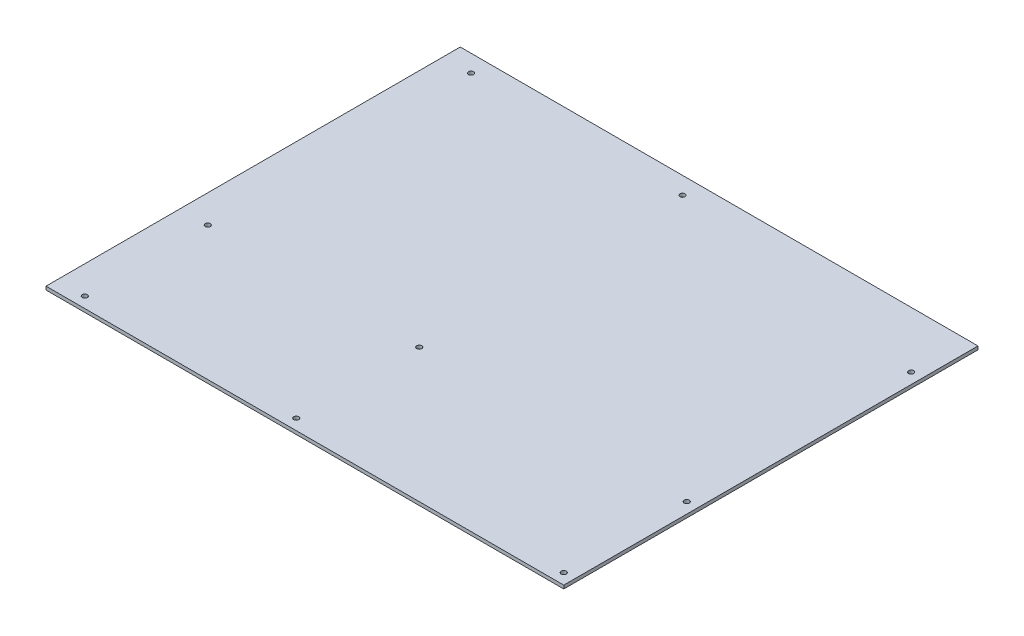
ISO-10303-21;
HEADER;
FILE_DESCRIPTION(('STEP AP214'),'2;1');
FILE_NAME('part.step','',(''),(''),'','','');
FILE_SCHEMA(('AUTOMOTIVE_DESIGN { 1 0 10303 214 1 1 1 1 }'));
ENDSEC;
DATA;
#1=APPLICATION_CONTEXT('core data for automotive mechanical design processes');
#2=APPLICATION_PROTOCOL_DEFINITION('international standard','automotive_design',2000,#1);
#3=PRODUCT_CONTEXT('',#1,'mechanical');
#4=PRODUCT('Part','Part','',(#3));
#5=PRODUCT_RELATED_PRODUCT_CATEGORY('part','',(#4));
#6=PRODUCT_DEFINITION_FORMATION('','',#4);
#7=PRODUCT_DEFINITION_CONTEXT('part definition',#1,'design');
#8=PRODUCT_DEFINITION('design','',#6,#7);
#9=PRODUCT_DEFINITION_SHAPE('','',#8);
#10=(LENGTH_UNIT() NAMED_UNIT(*) SI_UNIT(.MILLI.,.METRE.));
#11=(NAMED_UNIT(*) PLANE_ANGLE_UNIT() SI_UNIT($,.RADIAN.));
#12=(NAMED_UNIT(*) SI_UNIT($,.STERADIAN.) SOLID_ANGLE_UNIT());
#13=UNCERTAINTY_MEASURE_WITH_UNIT(LENGTH_MEASURE(1.E-05),#10,'distance_accuracy_value','');
#14=(GEOMETRIC_REPRESENTATION_CONTEXT(3) GLOBAL_UNCERTAINTY_ASSIGNED_CONTEXT((#13)) GLOBAL_UNIT_ASSIGNED_CONTEXT((#10,
#11,#12)) REPRESENTATION_CONTEXT('',''));
#15=CARTESIAN_POINT('',(0.,0.,0.));
#16=DIRECTION('',(0.,0.,1.));
#17=DIRECTION('',(1.,0.,0.));
#18=AXIS2_PLACEMENT_3D('',#15,#16,#17);
#19=CARTESIAN_POINT('',(0.,2.,0.));
#20=DIRECTION('',(1.,0.,0.));
#21=DIRECTION('',(0.,0.,-1.));
#22=AXIS2_PLACEMENT_3D('',#19,#20,#21);
#23=PLANE('',#22);
#24=DIRECTION('',(0.,0.,1.));
#25=VECTOR('',#24,1.);
#26=CARTESIAN_POINT('',(0.,0.,0.));
#27=LINE('',#26,#25);
#28=CARTESIAN_POINT('',(0.,0.,-243.84));
#29=VERTEX_POINT('',#28);
#30=CARTESIAN_POINT('',(0.,0.,0.));
#31=VERTEX_POINT('',#30);
#32=EDGE_CURVE('E100',#29,#31,#27,.T.);
#33=ORIENTED_EDGE('',*,*,#32,.T.);
#34=DIRECTION('',(0.,-1.,0.));
#35=VECTOR('',#34,1.);
#36=CARTESIAN_POINT('',(0.,2.,0.));
#37=LINE('',#36,#35);
#38=CARTESIAN_POINT('',(0.,2.,0.));
#39=VERTEX_POINT('',#38);
#40=EDGE_CURVE('E11',#39,#31,#37,.T.);
#41=ORIENTED_EDGE('',*,*,#40,.F.);
#42=DIRECTION('',(0.,0.,1.));
#43=VECTOR('',#42,1.);
#44=CARTESIAN_POINT('',(0.,2.,0.));
#45=LINE('',#44,#43);
#46=CARTESIAN_POINT('',(0.,2.,-243.84));
#47=VERTEX_POINT('',#46);
#48=EDGE_CURVE('E88',#47,#39,#45,.T.);
#49=ORIENTED_EDGE('',*,*,#48,.F.);
#50=DIRECTION('',(0.,-1.,0.));
#51=VECTOR('',#50,1.);
#52=CARTESIAN_POINT('',(0.,2.,-243.84));
#53=LINE('',#52,#51);
#54=EDGE_CURVE('E96',#47,#29,#53,.T.);
#55=ORIENTED_EDGE('',*,*,#54,.T.);
#56=EDGE_LOOP('',(#33,#41,#49,#55));
#57=FACE_BOUND('',#56,.T.);
#58=ADVANCED_FACE('F37',(#57),#23,.F.);
#59=CARTESIAN_POINT('',(0.,2.,0.));
#60=DIRECTION('',(0.,0.,-1.));
#61=DIRECTION('',(-1.,0.,0.));
#62=AXIS2_PLACEMENT_3D('',#59,#60,#61);
#63=PLANE('',#62);
#64=DIRECTION('',(1.,0.,0.));
#65=VECTOR('',#64,1.);
#66=CARTESIAN_POINT('',(0.,0.,0.));
#67=LINE('',#66,#65);
#68=CARTESIAN_POINT('',(304.8,0.,0.));
#69=VERTEX_POINT('',#68);
#70=EDGE_CURVE('E92',#31,#69,#67,.T.);
#71=ORIENTED_EDGE('',*,*,#70,.T.);
#72=DIRECTION('',(0.,-1.,0.));
#73=VECTOR('',#72,1.);
#74=CARTESIAN_POINT('',(304.8,2.,0.));
#75=LINE('',#74,#73);
#76=CARTESIAN_POINT('',(304.8,2.,0.));
#77=VERTEX_POINT('',#76);
#78=EDGE_CURVE('E45',#77,#69,#75,.T.);
#79=ORIENTED_EDGE('',*,*,#78,.F.);
#80=DIRECTION('',(1.,0.,0.));
#81=VECTOR('',#80,1.);
#82=CARTESIAN_POINT('',(0.,2.,0.));
#83=LINE('',#82,#81);
#84=EDGE_CURVE('E83',#39,#77,#83,.T.);
#85=ORIENTED_EDGE('',*,*,#84,.F.);
#86=ORIENTED_EDGE('',*,*,#40,.T.);
#87=EDGE_LOOP('',(#71,#79,#85,#86));
#88=FACE_BOUND('',#87,.T.);
#89=ADVANCED_FACE('F91',(#88),#63,.F.);
#90=CARTESIAN_POINT('',(304.8,2.,0.));
#91=DIRECTION('',(-1.,0.,0.));
#92=DIRECTION('',(0.,0.,1.));
#93=AXIS2_PLACEMENT_3D('',#90,#91,#92);
#94=PLANE('',#93);
#95=DIRECTION('',(0.,0.,-1.));
#96=VECTOR('',#95,1.);
#97=CARTESIAN_POINT('',(304.8,0.,0.));
#98=LINE('',#97,#96);
#99=CARTESIAN_POINT('',(304.8,0.,-243.84));
#100=VERTEX_POINT('',#99);
#101=EDGE_CURVE('E70',#69,#100,#98,.T.);
#102=ORIENTED_EDGE('',*,*,#101,.T.);
#103=DIRECTION('',(0.,-1.,0.));
#104=VECTOR('',#103,1.);
#105=CARTESIAN_POINT('',(304.8,2.,-243.84));
#106=LINE('',#105,#104);
#107=CARTESIAN_POINT('',(304.8,2.,-243.84));
#108=VERTEX_POINT('',#107);
#109=EDGE_CURVE('E93',#108,#100,#106,.T.);
#110=ORIENTED_EDGE('',*,*,#109,.F.);
#111=DIRECTION('',(0.,0.,-1.));
#112=VECTOR('',#111,1.);
#113=CARTESIAN_POINT('',(304.8,2.,0.));
#114=LINE('',#113,#112);
#115=EDGE_CURVE('E86',#77,#108,#114,.T.);
#116=ORIENTED_EDGE('',*,*,#115,.F.);
#117=ORIENTED_EDGE('',*,*,#78,.T.);
#118=EDGE_LOOP('',(#102,#110,#116,#117));
#119=FACE_BOUND('',#118,.T.);
#120=ADVANCED_FACE('F94',(#119),#94,.F.);
#121=CARTESIAN_POINT('',(0.,2.,-243.84));
#122=DIRECTION('',(0.,0.,1.));
#123=DIRECTION('',(1.,0.,0.));
#124=AXIS2_PLACEMENT_3D('',#121,#122,#123);
#125=PLANE('',#124);
#126=DIRECTION('',(-1.,0.,0.));
#127=VECTOR('',#126,1.);
#128=CARTESIAN_POINT('',(0.,0.,-243.84));
#129=LINE('',#128,#127);
#130=EDGE_CURVE('E76',#100,#29,#129,.T.);
#131=ORIENTED_EDGE('',*,*,#130,.T.);
#132=ORIENTED_EDGE('',*,*,#54,.F.);
#133=DIRECTION('',(-1.,0.,0.));
#134=VECTOR('',#133,1.);
#135=CARTESIAN_POINT('',(0.,2.,-243.84));
#136=LINE('',#135,#134);
#137=EDGE_CURVE('E53',#108,#47,#136,.T.);
#138=ORIENTED_EDGE('',*,*,#137,.F.);
#139=ORIENTED_EDGE('',*,*,#109,.T.);
#140=EDGE_LOOP('',(#131,#132,#138,#139));
#141=FACE_BOUND('',#140,.T.);
#142=ADVANCED_FACE('F108',(#141),#125,.F.);
#143=CARTESIAN_POINT('',(0.,2.,0.));
#144=DIRECTION('',(0.,-1.,0.));
#145=DIRECTION('',(0.,0.,-1.));
#146=AXIS2_PLACEMENT_3D('',#143,#144,#145);
#147=PLANE('',#146);
#148=CARTESIAN_POINT('',(298.45,2.,-210.82));
#149=DIRECTION('',(0.,1.,0.));
#150=DIRECTION('',(0.,0.,1.));
#151=AXIS2_PLACEMENT_3D('',#148,#149,#150);
#152=CIRCLE('',#151,1.50000000000002);
#153=CARTESIAN_POINT('',(298.45,2.,-209.32));
#154=VERTEX_POINT('',#153);
#155=EDGE_CURVE('E144',#154,#154,#152,.T.);
#156=ORIENTED_EDGE('',*,*,#155,.F.);
#157=EDGE_LOOP('',(#156));
#158=FACE_BOUND('',#157,.T.);
#159=CARTESIAN_POINT('',(140.97,2.,-233.68));
#160=DIRECTION('',(0.,1.,0.));
#161=DIRECTION('',(0.,0.,1.));
#162=AXIS2_PLACEMENT_3D('',#159,#160,#161);
#163=CIRCLE('',#162,1.5);
#164=CARTESIAN_POINT('',(140.97,2.,-232.18));
#165=VERTEX_POINT('',#164);
#166=EDGE_CURVE('E150',#165,#165,#163,.T.);
#167=ORIENTED_EDGE('',*,*,#166,.F.);
#168=EDGE_LOOP('',(#167));
#169=FACE_BOUND('',#168,.T.);
#170=CARTESIAN_POINT('',(16.51,2.,-233.68));
#171=DIRECTION('',(0.,1.,0.));
#172=DIRECTION('',(0.,0.,1.));
#173=AXIS2_PLACEMENT_3D('',#170,#171,#172);
#174=CIRCLE('',#173,1.5);
#175=CARTESIAN_POINT('',(16.51,2.,-232.18));
#176=VERTEX_POINT('',#175);
#177=EDGE_CURVE('E156',#176,#176,#174,.T.);
#178=ORIENTED_EDGE('',*,*,#177,.F.);
#179=EDGE_LOOP('',(#178));
#180=FACE_BOUND('',#179,.T.);
#181=CARTESIAN_POINT('',(16.51,2.,-78.74));
#182=DIRECTION('',(0.,1.,0.));
#183=DIRECTION('',(0.,0.,1.));
#184=AXIS2_PLACEMENT_3D('',#181,#182,#183);
#185=CIRCLE('',#184,1.5);
#186=CARTESIAN_POINT('',(16.51,2.,-77.24));
#187=VERTEX_POINT('',#186);
#188=EDGE_CURVE('E162',#187,#187,#185,.T.);
#189=ORIENTED_EDGE('',*,*,#188,.F.);
#190=EDGE_LOOP('',(#189));
#191=FACE_BOUND('',#190,.T.);
#192=CARTESIAN_POINT('',(140.97,2.,-78.74));
#193=DIRECTION('',(0.,1.,0.));
#194=DIRECTION('',(0.,0.,1.));
#195=AXIS2_PLACEMENT_3D('',#192,#193,#194);
#196=CIRCLE('',#195,1.5);
#197=CARTESIAN_POINT('',(140.97,2.,-77.24));
#198=VERTEX_POINT('',#197);
#199=EDGE_CURVE('E120',#198,#198,#196,.T.);
#200=ORIENTED_EDGE('',*,*,#199,.F.);
#201=EDGE_LOOP('',(#200));
#202=FACE_BOUND('',#201,.T.);
#203=CARTESIAN_POINT('',(298.45,2.,-78.74));
#204=DIRECTION('',(0.,1.,0.));
#205=DIRECTION('',(0.,0.,1.));
#206=AXIS2_PLACEMENT_3D('',#203,#204,#205);
#207=CIRCLE('',#206,1.50000000000002);
#208=CARTESIAN_POINT('',(298.45,2.,-77.2399999999999));
#209=VERTEX_POINT('',#208);
#210=EDGE_CURVE('E127',#209,#209,#207,.T.);
#211=ORIENTED_EDGE('',*,*,#210,.F.);
#212=EDGE_LOOP('',(#211));
#213=FACE_BOUND('',#212,.T.);
#214=CARTESIAN_POINT('',(298.45,2.,-6.34999999999997));
#215=DIRECTION('',(0.,1.,0.));
#216=DIRECTION('',(0.,0.,1.));
#217=AXIS2_PLACEMENT_3D('',#214,#215,#216);
#218=CIRCLE('',#217,1.50000000000002);
#219=CARTESIAN_POINT('',(298.45,2.,-4.84999999999994));
#220=VERTEX_POINT('',#219);
#221=EDGE_CURVE('E133',#220,#220,#218,.T.);
#222=ORIENTED_EDGE('',*,*,#221,.F.);
#223=EDGE_LOOP('',(#222));
#224=FACE_BOUND('',#223,.T.);
#225=CARTESIAN_POINT('',(140.97,2.,-6.34999999999997));
#226=DIRECTION('',(0.,1.,0.));
#227=DIRECTION('',(0.,0.,1.));
#228=AXIS2_PLACEMENT_3D('',#225,#226,#227);
#229=CIRCLE('',#228,1.5);
#230=CARTESIAN_POINT('',(140.97,2.,-4.84999999999997));
#231=VERTEX_POINT('',#230);
#232=EDGE_CURVE('E139',#231,#231,#229,.T.);
#233=ORIENTED_EDGE('',*,*,#232,.F.);
#234=EDGE_LOOP('',(#233));
#235=FACE_BOUND('',#234,.T.);
#236=CARTESIAN_POINT('',(16.51,2.,-6.34999999999997));
#237=DIRECTION('',(0.,1.,0.));
#238=DIRECTION('',(0.,0.,1.));
#239=AXIS2_PLACEMENT_3D('',#236,#237,#238);
#240=CIRCLE('',#239,1.5);
#241=CARTESIAN_POINT('',(16.51,2.,-4.84999999999997));
#242=VERTEX_POINT('',#241);
#243=EDGE_CURVE('E114',#242,#242,#240,.T.);
#244=ORIENTED_EDGE('',*,*,#243,.F.);
#245=EDGE_LOOP('',(#244));
#246=FACE_BOUND('',#245,.T.);
#247=ORIENTED_EDGE('',*,*,#48,.T.);
#248=ORIENTED_EDGE('',*,*,#84,.T.);
#249=ORIENTED_EDGE('',*,*,#115,.T.);
#250=ORIENTED_EDGE('',*,*,#137,.T.);
#251=EDGE_LOOP('',(#247,#248,#249,#250));
#252=FACE_BOUND('',#251,.T.);
#253=ADVANCED_FACE('F84',(#158,#169,#180,#191,#202,#213,#224,#235,#246,#252),#147,.F.);
#254=CARTESIAN_POINT('',(0.,0.,0.));
#255=DIRECTION('',(0.,-1.,0.));
#256=DIRECTION('',(0.,0.,-1.));
#257=AXIS2_PLACEMENT_3D('',#254,#255,#256);
#258=PLANE('',#257);
#259=CARTESIAN_POINT('',(298.45,0.,-210.82));
#260=DIRECTION('',(0.,1.,0.));
#261=DIRECTION('',(0.,0.,1.));
#262=AXIS2_PLACEMENT_3D('',#259,#260,#261);
#263=CIRCLE('',#262,1.50000000000002);
#264=CARTESIAN_POINT('',(298.45,0.,-209.32));
#265=VERTEX_POINT('',#264);
#266=EDGE_CURVE('E147',#265,#265,#263,.T.);
#267=ORIENTED_EDGE('',*,*,#266,.T.);
#268=EDGE_LOOP('',(#267));
#269=FACE_BOUND('',#268,.T.);
#270=CARTESIAN_POINT('',(140.97,0.,-233.68));
#271=DIRECTION('',(0.,1.,0.));
#272=DIRECTION('',(0.,0.,1.));
#273=AXIS2_PLACEMENT_3D('',#270,#271,#272);
#274=CIRCLE('',#273,1.5);
#275=CARTESIAN_POINT('',(140.97,0.,-232.18));
#276=VERTEX_POINT('',#275);
#277=EDGE_CURVE('E153',#276,#276,#274,.T.);
#278=ORIENTED_EDGE('',*,*,#277,.T.);
#279=EDGE_LOOP('',(#278));
#280=FACE_BOUND('',#279,.T.);
#281=CARTESIAN_POINT('',(16.51,0.,-233.68));
#282=DIRECTION('',(0.,1.,0.));
#283=DIRECTION('',(0.,0.,1.));
#284=AXIS2_PLACEMENT_3D('',#281,#282,#283);
#285=CIRCLE('',#284,1.5);
#286=CARTESIAN_POINT('',(16.51,0.,-232.18));
#287=VERTEX_POINT('',#286);
#288=EDGE_CURVE('E159',#287,#287,#285,.T.);
#289=ORIENTED_EDGE('',*,*,#288,.T.);
#290=EDGE_LOOP('',(#289));
#291=FACE_BOUND('',#290,.T.);
#292=CARTESIAN_POINT('',(16.51,0.,-78.74));
#293=DIRECTION('',(0.,1.,0.));
#294=DIRECTION('',(0.,0.,1.));
#295=AXIS2_PLACEMENT_3D('',#292,#293,#294);
#296=CIRCLE('',#295,1.5);
#297=CARTESIAN_POINT('',(16.51,0.,-77.24));
#298=VERTEX_POINT('',#297);
#299=EDGE_CURVE('E124',#298,#298,#296,.T.);
#300=ORIENTED_EDGE('',*,*,#299,.T.);
#301=EDGE_LOOP('',(#300));
#302=FACE_BOUND('',#301,.T.);
#303=CARTESIAN_POINT('',(140.97,0.,-78.74));
#304=DIRECTION('',(0.,1.,0.));
#305=DIRECTION('',(0.,0.,1.));
#306=AXIS2_PLACEMENT_3D('',#303,#304,#305);
#307=CIRCLE('',#306,1.5);
#308=CARTESIAN_POINT('',(140.97,0.,-77.24));
#309=VERTEX_POINT('',#308);
#310=EDGE_CURVE('E123',#309,#309,#307,.T.);
#311=ORIENTED_EDGE('',*,*,#310,.T.);
#312=EDGE_LOOP('',(#311));
#313=FACE_BOUND('',#312,.T.);
#314=CARTESIAN_POINT('',(298.45,0.,-78.74));
#315=DIRECTION('',(0.,1.,0.));
#316=DIRECTION('',(0.,0.,1.));
#317=AXIS2_PLACEMENT_3D('',#314,#315,#316);
#318=CIRCLE('',#317,1.50000000000002);
#319=CARTESIAN_POINT('',(298.45,0.,-77.2399999999999));
#320=VERTEX_POINT('',#319);
#321=EDGE_CURVE('E130',#320,#320,#318,.T.);
#322=ORIENTED_EDGE('',*,*,#321,.T.);
#323=EDGE_LOOP('',(#322));
#324=FACE_BOUND('',#323,.T.);
#325=CARTESIAN_POINT('',(298.45,0.,-6.34999999999997));
#326=DIRECTION('',(0.,1.,0.));
#327=DIRECTION('',(0.,0.,1.));
#328=AXIS2_PLACEMENT_3D('',#325,#326,#327);
#329=CIRCLE('',#328,1.50000000000002);
#330=CARTESIAN_POINT('',(298.45,0.,-4.84999999999994));
#331=VERTEX_POINT('',#330);
#332=EDGE_CURVE('E136',#331,#331,#329,.T.);
#333=ORIENTED_EDGE('',*,*,#332,.T.);
#334=EDGE_LOOP('',(#333));
#335=FACE_BOUND('',#334,.T.);
#336=CARTESIAN_POINT('',(140.97,0.,-6.34999999999997));
#337=DIRECTION('',(0.,1.,0.));
#338=DIRECTION('',(0.,0.,1.));
#339=AXIS2_PLACEMENT_3D('',#336,#337,#338);
#340=CIRCLE('',#339,1.5);
#341=CARTESIAN_POINT('',(140.97,0.,-4.84999999999997));
#342=VERTEX_POINT('',#341);
#343=EDGE_CURVE('E117',#342,#342,#340,.T.);
#344=ORIENTED_EDGE('',*,*,#343,.T.);
#345=EDGE_LOOP('',(#344));
#346=FACE_BOUND('',#345,.T.);
#347=CARTESIAN_POINT('',(16.51,0.,-6.34999999999997));
#348=DIRECTION('',(0.,1.,0.));
#349=DIRECTION('',(0.,0.,1.));
#350=AXIS2_PLACEMENT_3D('',#347,#348,#349);
#351=CIRCLE('',#350,1.5);
#352=CARTESIAN_POINT('',(16.51,0.,-4.84999999999997));
#353=VERTEX_POINT('',#352);
#354=EDGE_CURVE('E103',#353,#353,#351,.T.);
#355=ORIENTED_EDGE('',*,*,#354,.T.);
#356=EDGE_LOOP('',(#355));
#357=FACE_BOUND('',#356,.T.);
#358=ORIENTED_EDGE('',*,*,#32,.F.);
#359=ORIENTED_EDGE('',*,*,#130,.F.);
#360=ORIENTED_EDGE('',*,*,#101,.F.);
#361=ORIENTED_EDGE('',*,*,#70,.F.);
#362=EDGE_LOOP('',(#358,#359,#360,#361));
#363=FACE_BOUND('',#362,.T.);
#364=ADVANCED_FACE('F111',(#269,#280,#291,#302,#313,#324,#335,#346,#357,#363),#258,.T.);
#365=CARTESIAN_POINT('',(16.51,0.,-6.34999999999997));
#366=DIRECTION('',(0.,1.,0.));
#367=DIRECTION('',(0.,0.,1.));
#368=AXIS2_PLACEMENT_3D('',#365,#366,#367);
#369=CYLINDRICAL_SURFACE('',#368,1.5);
#370=ORIENTED_EDGE('',*,*,#354,.F.);
#371=EDGE_LOOP('',(#370));
#372=FACE_BOUND('',#371,.T.);
#373=ORIENTED_EDGE('',*,*,#243,.T.);
#374=EDGE_LOOP('',(#373));
#375=FACE_BOUND('',#374,.T.);
#376=ADVANCED_FACE('F192',(#372,#375),#369,.F.);
#377=CARTESIAN_POINT('',(140.97,0.,-6.34999999999997));
#378=DIRECTION('',(0.,1.,0.));
#379=DIRECTION('',(0.,0.,1.));
#380=AXIS2_PLACEMENT_3D('',#377,#378,#379);
#381=CYLINDRICAL_SURFACE('',#380,1.5);
#382=ORIENTED_EDGE('',*,*,#343,.F.);
#383=EDGE_LOOP('',(#382));
#384=FACE_BOUND('',#383,.T.);
#385=ORIENTED_EDGE('',*,*,#232,.T.);
#386=EDGE_LOOP('',(#385));
#387=FACE_BOUND('',#386,.T.);
#388=ADVANCED_FACE('F194',(#384,#387),#381,.F.);
#389=CARTESIAN_POINT('',(298.45,0.,-6.34999999999997));
#390=DIRECTION('',(0.,1.,0.));
#391=DIRECTION('',(0.,0.,1.));
#392=AXIS2_PLACEMENT_3D('',#389,#390,#391);
#393=CYLINDRICAL_SURFACE('',#392,1.50000000000002);
#394=ORIENTED_EDGE('',*,*,#332,.F.);
#395=EDGE_LOOP('',(#394));
#396=FACE_BOUND('',#395,.T.);
#397=ORIENTED_EDGE('',*,*,#221,.T.);
#398=EDGE_LOOP('',(#397));
#399=FACE_BOUND('',#398,.T.);
#400=ADVANCED_FACE('F201',(#396,#399),#393,.F.);
#401=CARTESIAN_POINT('',(298.45,0.,-78.74));
#402=DIRECTION('',(0.,1.,0.));
#403=DIRECTION('',(0.,0.,1.));
#404=AXIS2_PLACEMENT_3D('',#401,#402,#403);
#405=CYLINDRICAL_SURFACE('',#404,1.50000000000002);
#406=ORIENTED_EDGE('',*,*,#321,.F.);
#407=EDGE_LOOP('',(#406));
#408=FACE_BOUND('',#407,.T.);
#409=ORIENTED_EDGE('',*,*,#210,.T.);
#410=EDGE_LOOP('',(#409));
#411=FACE_BOUND('',#410,.T.);
#412=ADVANCED_FACE('F249',(#408,#411),#405,.F.);
#413=CARTESIAN_POINT('',(140.97,0.,-78.74));
#414=DIRECTION('',(0.,1.,0.));
#415=DIRECTION('',(0.,0.,1.));
#416=AXIS2_PLACEMENT_3D('',#413,#414,#415);
#417=CYLINDRICAL_SURFACE('',#416,1.5);
#418=ORIENTED_EDGE('',*,*,#310,.F.);
#419=EDGE_LOOP('',(#418));
#420=FACE_BOUND('',#419,.T.);
#421=ORIENTED_EDGE('',*,*,#199,.T.);
#422=EDGE_LOOP('',(#421));
#423=FACE_BOUND('',#422,.T.);
#424=ADVANCED_FACE('F174',(#420,#423),#417,.F.);
#425=CARTESIAN_POINT('',(16.51,0.,-78.74));
#426=DIRECTION('',(0.,1.,0.));
#427=DIRECTION('',(0.,0.,1.));
#428=AXIS2_PLACEMENT_3D('',#425,#426,#427);
#429=CYLINDRICAL_SURFACE('',#428,1.5);
#430=ORIENTED_EDGE('',*,*,#299,.F.);
#431=EDGE_LOOP('',(#430));
#432=FACE_BOUND('',#431,.T.);
#433=ORIENTED_EDGE('',*,*,#188,.T.);
#434=EDGE_LOOP('',(#433));
#435=FACE_BOUND('',#434,.T.);
#436=ADVANCED_FACE('F170',(#432,#435),#429,.F.);
#437=CARTESIAN_POINT('',(16.51,0.,-233.68));
#438=DIRECTION('',(0.,1.,0.));
#439=DIRECTION('',(0.,0.,1.));
#440=AXIS2_PLACEMENT_3D('',#437,#438,#439);
#441=CYLINDRICAL_SURFACE('',#440,1.5);
#442=ORIENTED_EDGE('',*,*,#288,.F.);
#443=EDGE_LOOP('',(#442));
#444=FACE_BOUND('',#443,.T.);
#445=ORIENTED_EDGE('',*,*,#177,.T.);
#446=EDGE_LOOP('',(#445));
#447=FACE_BOUND('',#446,.T.);
#448=ADVANCED_FACE('F173',(#444,#447),#441,.F.);
#449=CARTESIAN_POINT('',(140.97,0.,-233.68));
#450=DIRECTION('',(0.,1.,0.));
#451=DIRECTION('',(0.,0.,1.));
#452=AXIS2_PLACEMENT_3D('',#449,#450,#451);
#453=CYLINDRICAL_SURFACE('',#452,1.5);
#454=ORIENTED_EDGE('',*,*,#277,.F.);
#455=EDGE_LOOP('',(#454));
#456=FACE_BOUND('',#455,.T.);
#457=ORIENTED_EDGE('',*,*,#166,.T.);
#458=EDGE_LOOP('',(#457));
#459=FACE_BOUND('',#458,.T.);
#460=ADVANCED_FACE('F282',(#456,#459),#453,.F.);
#461=CARTESIAN_POINT('',(298.45,0.,-210.82));
#462=DIRECTION('',(0.,1.,0.));
#463=DIRECTION('',(0.,0.,1.));
#464=AXIS2_PLACEMENT_3D('',#461,#462,#463);
#465=CYLINDRICAL_SURFACE('',#464,1.50000000000002);
#466=ORIENTED_EDGE('',*,*,#266,.F.);
#467=EDGE_LOOP('',(#466));
#468=FACE_BOUND('',#467,.T.);
#469=ORIENTED_EDGE('',*,*,#155,.T.);
#470=EDGE_LOOP('',(#469));
#471=FACE_BOUND('',#470,.T.);
#472=ADVANCED_FACE('F292',(#468,#471),#465,.F.);
#473=CLOSED_SHELL('',(#58,#89,#120,#142,#253,#364,#376,#388,#400,#412,#424,#436,#448,#460,#472));
#474=MANIFOLD_SOLID_BREP('B2',#473);
#475=ADVANCED_BREP_SHAPE_REPRESENTATION('',(#18,#474),#14);
#476=SHAPE_DEFINITION_REPRESENTATION(#9,#475);
ENDSEC;
END-ISO-10303-21;
